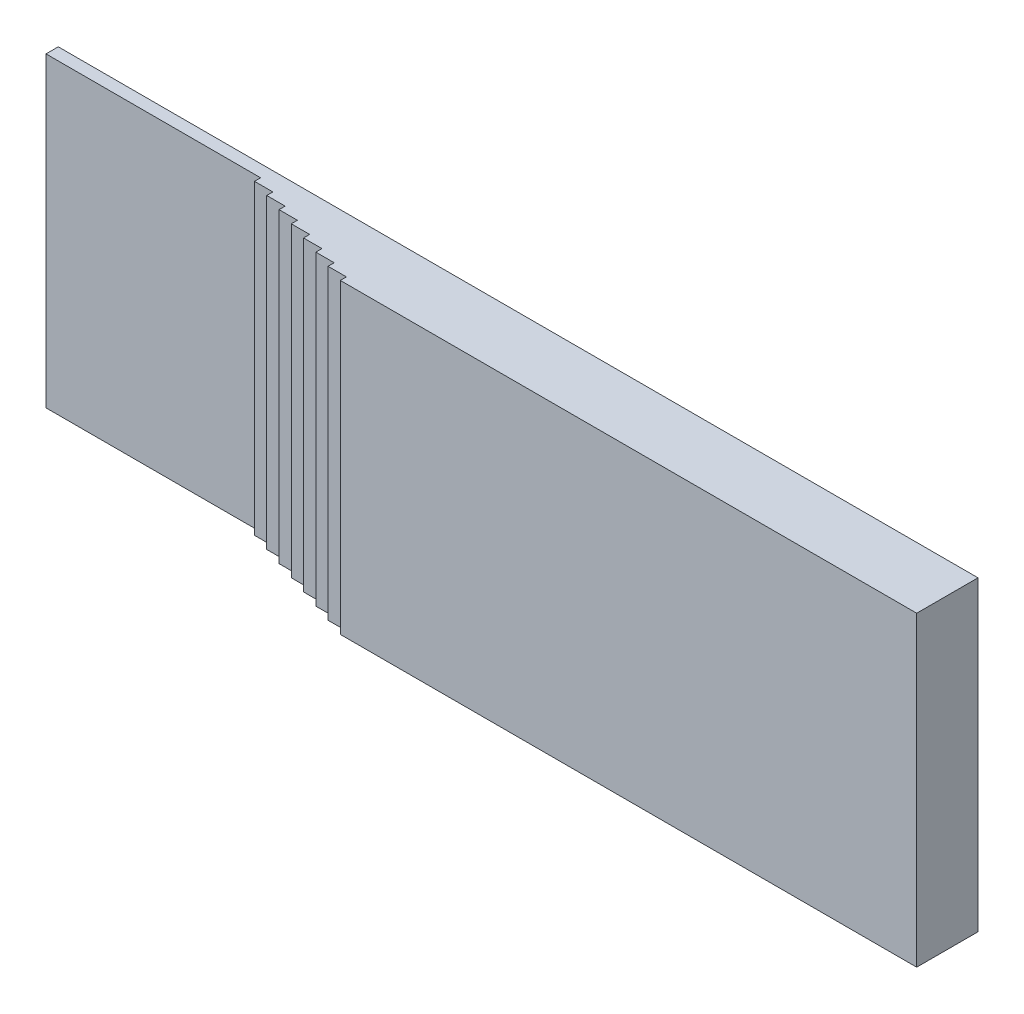
ISO-10303-21;
HEADER;
FILE_DESCRIPTION(('STEP AP214'),'2;1');
FILE_NAME('part.step','',(''),(''),'','','');
FILE_SCHEMA(('AUTOMOTIVE_DESIGN { 1 0 10303 214 1 1 1 1 }'));
ENDSEC;
DATA;
#1=APPLICATION_CONTEXT('core data for automotive mechanical design processes');
#2=APPLICATION_PROTOCOL_DEFINITION('international standard','automotive_design',2000,#1);
#3=PRODUCT_CONTEXT('',#1,'mechanical');
#4=PRODUCT('Part','Part','',(#3));
#5=PRODUCT_RELATED_PRODUCT_CATEGORY('part','',(#4));
#6=PRODUCT_DEFINITION_FORMATION('','',#4);
#7=PRODUCT_DEFINITION_CONTEXT('part definition',#1,'design');
#8=PRODUCT_DEFINITION('design','',#6,#7);
#9=PRODUCT_DEFINITION_SHAPE('','',#8);
#10=(LENGTH_UNIT() NAMED_UNIT(*) SI_UNIT(.MILLI.,.METRE.));
#11=(NAMED_UNIT(*) PLANE_ANGLE_UNIT() SI_UNIT($,.RADIAN.));
#12=(NAMED_UNIT(*) SI_UNIT($,.STERADIAN.) SOLID_ANGLE_UNIT());
#13=UNCERTAINTY_MEASURE_WITH_UNIT(LENGTH_MEASURE(1.E-05),#10,'distance_accuracy_value','');
#14=(GEOMETRIC_REPRESENTATION_CONTEXT(3) GLOBAL_UNCERTAINTY_ASSIGNED_CONTEXT((#13)) GLOBAL_UNIT_ASSIGNED_CONTEXT((#10,
#11,#12)) REPRESENTATION_CONTEXT('',''));
#15=CARTESIAN_POINT('',(0.,0.,0.));
#16=DIRECTION('',(0.,0.,1.));
#17=DIRECTION('',(1.,0.,0.));
#18=AXIS2_PLACEMENT_3D('',#15,#16,#17);
#19=CARTESIAN_POINT('',(0.,0.,200.));
#20=DIRECTION('',(0.,0.,1.));
#21=DIRECTION('',(1.,0.,0.));
#22=AXIS2_PLACEMENT_3D('',#19,#20,#21);
#23=PLANE('',#22);
#24=DIRECTION('',(1.,0.,0.));
#25=VECTOR('',#24,1.);
#26=CARTESIAN_POINT('',(-2500.,-2500.,200.));
#27=LINE('',#26,#25);
#28=CARTESIAN_POINT('',(-2500.,-2500.,200.));
#29=VERTEX_POINT('',#28);
#30=CARTESIAN_POINT('',(999.999999999999,-2500.,200.));
#31=VERTEX_POINT('',#30);
#32=EDGE_CURVE('E57',#29,#31,#27,.T.);
#33=ORIENTED_EDGE('',*,*,#32,.T.);
#34=DIRECTION('',(0.,1.,0.));
#35=VECTOR('',#34,1.);
#36=CARTESIAN_POINT('',(1000.,0.,200.));
#37=LINE('',#36,#35);
#38=CARTESIAN_POINT('',(1000.,2500.,200.));
#39=VERTEX_POINT('',#38);
#40=EDGE_CURVE('E62',#31,#39,#37,.T.);
#41=ORIENTED_EDGE('',*,*,#40,.T.);
#42=DIRECTION('',(-1.,0.,0.));
#43=VECTOR('',#42,1.);
#44=CARTESIAN_POINT('',(-2500.,2500.,200.));
#45=LINE('',#44,#43);
#46=CARTESIAN_POINT('',(-2500.,2500.,200.));
#47=VERTEX_POINT('',#46);
#48=EDGE_CURVE('E369',#39,#47,#45,.T.);
#49=ORIENTED_EDGE('',*,*,#48,.T.);
#50=DIRECTION('',(0.,-1.,0.));
#51=VECTOR('',#50,1.);
#52=CARTESIAN_POINT('',(-2500.,2500.,200.));
#53=LINE('',#52,#51);
#54=EDGE_CURVE('E372',#47,#29,#53,.T.);
#55=ORIENTED_EDGE('',*,*,#54,.T.);
#56=EDGE_LOOP('',(#33,#41,#49,#55));
#57=FACE_BOUND('',#56,.T.);
#58=ADVANCED_FACE('F41',(#57),#23,.T.);
#59=CARTESIAN_POINT('',(12500.,2500.,200.));
#60=DIRECTION('',(-1.,0.,0.));
#61=DIRECTION('',(0.,-1.,0.));
#62=AXIS2_PLACEMENT_3D('',#59,#60,#61);
#63=PLANE('',#62);
#64=DIRECTION('',(0.,1.,0.));
#65=VECTOR('',#64,1.);
#66=CARTESIAN_POINT('',(12500.,2500.,0.));
#67=LINE('',#66,#65);
#68=CARTESIAN_POINT('',(12500.,-2500.,0.));
#69=VERTEX_POINT('',#68);
#70=CARTESIAN_POINT('',(12500.,2500.,0.));
#71=VERTEX_POINT('',#70);
#72=EDGE_CURVE('E183',#69,#71,#67,.T.);
#73=ORIENTED_EDGE('',*,*,#72,.T.);
#74=DIRECTION('',(0.,0.,-1.));
#75=VECTOR('',#74,1.);
#76=CARTESIAN_POINT('',(12500.,2500.,200.));
#77=LINE('',#76,#75);
#78=CARTESIAN_POINT('',(12500.,2500.,1000.));
#79=VERTEX_POINT('',#78);
#80=EDGE_CURVE('E11',#79,#71,#77,.T.);
#81=ORIENTED_EDGE('',*,*,#80,.F.);
#82=DIRECTION('',(0.,1.,0.));
#83=VECTOR('',#82,1.);
#84=CARTESIAN_POINT('',(12500.,-2500.,1000.));
#85=LINE('',#84,#83);
#86=CARTESIAN_POINT('',(12500.,-2500.,1000.));
#87=VERTEX_POINT('',#86);
#88=EDGE_CURVE('E181',#87,#79,#85,.T.);
#89=ORIENTED_EDGE('',*,*,#88,.F.);
#90=DIRECTION('',(0.,0.,-1.));
#91=VECTOR('',#90,1.);
#92=CARTESIAN_POINT('',(12500.,-2500.,200.));
#93=LINE('',#92,#91);
#94=EDGE_CURVE('E378',#87,#69,#93,.T.);
#95=ORIENTED_EDGE('',*,*,#94,.T.);
#96=EDGE_LOOP('',(#73,#81,#89,#95));
#97=FACE_BOUND('',#96,.T.);
#98=ADVANCED_FACE('F43',(#97),#63,.F.);
#99=CARTESIAN_POINT('',(-2500.,2500.,200.));
#100=DIRECTION('',(0.,-1.,0.));
#101=DIRECTION('',(1.,0.,0.));
#102=AXIS2_PLACEMENT_3D('',#99,#100,#101);
#103=PLANE('',#102);
#104=DIRECTION('',(-1.,0.,0.));
#105=VECTOR('',#104,1.);
#106=CARTESIAN_POINT('',(-2500.,2500.,0.));
#107=LINE('',#106,#105);
#108=CARTESIAN_POINT('',(-2500.,2500.,0.));
#109=VERTEX_POINT('',#108);
#110=EDGE_CURVE('E381',#71,#109,#107,.T.);
#111=ORIENTED_EDGE('',*,*,#110,.T.);
#112=DIRECTION('',(0.,0.,-1.));
#113=VECTOR('',#112,1.);
#114=CARTESIAN_POINT('',(-2500.,2500.,200.));
#115=LINE('',#114,#113);
#116=EDGE_CURVE('E50',#47,#109,#115,.T.);
#117=ORIENTED_EDGE('',*,*,#116,.F.);
#118=ORIENTED_EDGE('',*,*,#48,.F.);
#119=DIRECTION('',(0.,0.,-1.));
#120=VECTOR('',#119,1.);
#121=CARTESIAN_POINT('',(1000.,2500.,300.));
#122=LINE('',#121,#120);
#123=CARTESIAN_POINT('',(1000.,2500.,300.));
#124=VERTEX_POINT('',#123);
#125=EDGE_CURVE('E365',#124,#39,#122,.T.);
#126=ORIENTED_EDGE('',*,*,#125,.F.);
#127=DIRECTION('',(-1.,0.,0.));
#128=VECTOR('',#127,1.);
#129=CARTESIAN_POINT('',(-1.48029736616688E-13,2500.,300.));
#130=LINE('',#129,#128);
#131=CARTESIAN_POINT('',(1300.,2500.,300.));
#132=VERTEX_POINT('',#131);
#133=EDGE_CURVE('E353',#132,#124,#130,.T.);
#134=ORIENTED_EDGE('',*,*,#133,.F.);
#135=DIRECTION('',(0.,0.,-1.));
#136=VECTOR('',#135,1.);
#137=CARTESIAN_POINT('',(1300.,2500.,400.));
#138=LINE('',#137,#136);
#139=CARTESIAN_POINT('',(1300.,2500.,400.));
#140=VERTEX_POINT('',#139);
#141=EDGE_CURVE('E342',#140,#132,#138,.T.);
#142=ORIENTED_EDGE('',*,*,#141,.F.);
#143=DIRECTION('',(-1.,0.,0.));
#144=VECTOR('',#143,1.);
#145=CARTESIAN_POINT('',(-1.48029736616688E-13,2500.,400.));
#146=LINE('',#145,#144);
#147=CARTESIAN_POINT('',(1600.,2500.,400.));
#148=VERTEX_POINT('',#147);
#149=EDGE_CURVE('E331',#148,#140,#146,.T.);
#150=ORIENTED_EDGE('',*,*,#149,.F.);
#151=DIRECTION('',(0.,0.,-1.));
#152=VECTOR('',#151,1.);
#153=CARTESIAN_POINT('',(1600.,2500.,500.));
#154=LINE('',#153,#152);
#155=CARTESIAN_POINT('',(1600.,2500.,500.));
#156=VERTEX_POINT('',#155);
#157=EDGE_CURVE('E320',#156,#148,#154,.T.);
#158=ORIENTED_EDGE('',*,*,#157,.F.);
#159=DIRECTION('',(-1.,0.,0.));
#160=VECTOR('',#159,1.);
#161=CARTESIAN_POINT('',(-1.48029736616688E-13,2500.,500.));
#162=LINE('',#161,#160);
#163=CARTESIAN_POINT('',(1900.,2500.,500.));
#164=VERTEX_POINT('',#163);
#165=EDGE_CURVE('E309',#164,#156,#162,.T.);
#166=ORIENTED_EDGE('',*,*,#165,.F.);
#167=DIRECTION('',(0.,0.,-1.));
#168=VECTOR('',#167,1.);
#169=CARTESIAN_POINT('',(1900.,2500.,600.));
#170=LINE('',#169,#168);
#171=CARTESIAN_POINT('',(1900.,2500.,600.));
#172=VERTEX_POINT('',#171);
#173=EDGE_CURVE('E298',#172,#164,#170,.T.);
#174=ORIENTED_EDGE('',*,*,#173,.F.);
#175=DIRECTION('',(-1.,0.,0.));
#176=VECTOR('',#175,1.);
#177=CARTESIAN_POINT('',(-1.48029736616688E-13,2500.,600.));
#178=LINE('',#177,#176);
#179=CARTESIAN_POINT('',(2200.,2500.,600.));
#180=VERTEX_POINT('',#179);
#181=EDGE_CURVE('E287',#180,#172,#178,.T.);
#182=ORIENTED_EDGE('',*,*,#181,.F.);
#183=DIRECTION('',(0.,0.,-1.));
#184=VECTOR('',#183,1.);
#185=CARTESIAN_POINT('',(2200.,2500.,700.));
#186=LINE('',#185,#184);
#187=CARTESIAN_POINT('',(2200.,2500.,700.));
#188=VERTEX_POINT('',#187);
#189=EDGE_CURVE('E276',#188,#180,#186,.T.);
#190=ORIENTED_EDGE('',*,*,#189,.F.);
#191=DIRECTION('',(-1.,0.,0.));
#192=VECTOR('',#191,1.);
#193=CARTESIAN_POINT('',(-1.48029736616688E-13,2500.,700.));
#194=LINE('',#193,#192);
#195=CARTESIAN_POINT('',(2500.,2500.,700.));
#196=VERTEX_POINT('',#195);
#197=EDGE_CURVE('E265',#196,#188,#194,.T.);
#198=ORIENTED_EDGE('',*,*,#197,.F.);
#199=DIRECTION('',(0.,0.,-1.));
#200=VECTOR('',#199,1.);
#201=CARTESIAN_POINT('',(2500.,2500.,800.));
#202=LINE('',#201,#200);
#203=CARTESIAN_POINT('',(2500.,2500.,800.));
#204=VERTEX_POINT('',#203);
#205=EDGE_CURVE('E254',#204,#196,#202,.T.);
#206=ORIENTED_EDGE('',*,*,#205,.F.);
#207=DIRECTION('',(-1.,0.,0.));
#208=VECTOR('',#207,1.);
#209=CARTESIAN_POINT('',(-1.48029736616688E-13,2500.,800.));
#210=LINE('',#209,#208);
#211=CARTESIAN_POINT('',(2800.,2500.,800.));
#212=VERTEX_POINT('',#211);
#213=EDGE_CURVE('E243',#212,#204,#210,.T.);
#214=ORIENTED_EDGE('',*,*,#213,.F.);
#215=DIRECTION('',(0.,0.,-1.));
#216=VECTOR('',#215,1.);
#217=CARTESIAN_POINT('',(2800.,2500.,900.));
#218=LINE('',#217,#216);
#219=CARTESIAN_POINT('',(2800.,2500.,900.));
#220=VERTEX_POINT('',#219);
#221=EDGE_CURVE('E232',#220,#212,#218,.T.);
#222=ORIENTED_EDGE('',*,*,#221,.F.);
#223=DIRECTION('',(-1.,0.,0.));
#224=VECTOR('',#223,1.);
#225=CARTESIAN_POINT('',(-1.48029736616688E-13,2500.,900.));
#226=LINE('',#225,#224);
#227=CARTESIAN_POINT('',(3100.,2500.,900.));
#228=VERTEX_POINT('',#227);
#229=EDGE_CURVE('E221',#228,#220,#226,.T.);
#230=ORIENTED_EDGE('',*,*,#229,.F.);
#231=DIRECTION('',(0.,0.,-1.));
#232=VECTOR('',#231,1.);
#233=CARTESIAN_POINT('',(3100.,2500.,1000.));
#234=LINE('',#233,#232);
#235=CARTESIAN_POINT('',(3100.,2500.,1000.));
#236=VERTEX_POINT('',#235);
#237=EDGE_CURVE('E189',#236,#228,#234,.T.);
#238=ORIENTED_EDGE('',*,*,#237,.F.);
#239=DIRECTION('',(-1.,0.,0.));
#240=VECTOR('',#239,1.);
#241=CARTESIAN_POINT('',(-1.48029736616688E-13,2500.,1000.));
#242=LINE('',#241,#240);
#243=EDGE_CURVE('E186',#79,#236,#242,.T.);
#244=ORIENTED_EDGE('',*,*,#243,.F.);
#245=ORIENTED_EDGE('',*,*,#80,.T.);
#246=EDGE_LOOP('',(#111,#117,#118,#126,#134,#142,#150,#158,#166,#174,#182,#190,#198,#206,#214,
#222,#230,#238,#244,#245));
#247=FACE_BOUND('',#246,.T.);
#248=ADVANCED_FACE('F187',(#247),#103,.F.);
#249=CARTESIAN_POINT('',(-2500.,2500.,200.));
#250=DIRECTION('',(1.,0.,0.));
#251=DIRECTION('',(0.,1.,0.));
#252=AXIS2_PLACEMENT_3D('',#249,#250,#251);
#253=PLANE('',#252);
#254=DIRECTION('',(0.,-1.,0.));
#255=VECTOR('',#254,1.);
#256=CARTESIAN_POINT('',(-2500.,2500.,0.));
#257=LINE('',#256,#255);
#258=CARTESIAN_POINT('',(-2500.,-2500.,0.));
#259=VERTEX_POINT('',#258);
#260=EDGE_CURVE('E384',#109,#259,#257,.T.);
#261=ORIENTED_EDGE('',*,*,#260,.T.);
#262=DIRECTION('',(0.,0.,-1.));
#263=VECTOR('',#262,1.);
#264=CARTESIAN_POINT('',(-2500.,-2500.,200.));
#265=LINE('',#264,#263);
#266=EDGE_CURVE('E391',#29,#259,#265,.T.);
#267=ORIENTED_EDGE('',*,*,#266,.F.);
#268=ORIENTED_EDGE('',*,*,#54,.F.);
#269=ORIENTED_EDGE('',*,*,#116,.T.);
#270=EDGE_LOOP('',(#261,#267,#268,#269));
#271=FACE_BOUND('',#270,.T.);
#272=ADVANCED_FACE('F400',(#271),#253,.F.);
#273=CARTESIAN_POINT('',(-2500.,-2500.,200.));
#274=DIRECTION('',(0.,1.,0.));
#275=DIRECTION('',(-1.,0.,0.));
#276=AXIS2_PLACEMENT_3D('',#273,#274,#275);
#277=PLANE('',#276);
#278=ORIENTED_EDGE('',*,*,#94,.F.);
#279=DIRECTION('',(1.,0.,0.));
#280=VECTOR('',#279,1.);
#281=CARTESIAN_POINT('',(1.48029736616687E-13,-2500.,1000.));
#282=LINE('',#281,#280);
#283=CARTESIAN_POINT('',(3100.,-2500.,1000.));
#284=VERTEX_POINT('',#283);
#285=EDGE_CURVE('E195',#284,#87,#282,.T.);
#286=ORIENTED_EDGE('',*,*,#285,.F.);
#287=DIRECTION('',(0.,0.,-1.));
#288=VECTOR('',#287,1.);
#289=CARTESIAN_POINT('',(3100.,-2500.,1000.));
#290=LINE('',#289,#288);
#291=CARTESIAN_POINT('',(3100.,-2500.,900.));
#292=VERTEX_POINT('',#291);
#293=EDGE_CURVE('E207',#284,#292,#290,.T.);
#294=ORIENTED_EDGE('',*,*,#293,.T.);
#295=DIRECTION('',(1.,0.,0.));
#296=VECTOR('',#295,1.);
#297=CARTESIAN_POINT('',(1.48029736616687E-13,-2500.,900.));
#298=LINE('',#297,#296);
#299=CARTESIAN_POINT('',(2800.,-2500.,900.));
#300=VERTEX_POINT('',#299);
#301=EDGE_CURVE('E213',#300,#292,#298,.T.);
#302=ORIENTED_EDGE('',*,*,#301,.F.);
#303=DIRECTION('',(0.,0.,-1.));
#304=VECTOR('',#303,1.);
#305=CARTESIAN_POINT('',(2800.,-2500.,900.));
#306=LINE('',#305,#304);
#307=CARTESIAN_POINT('',(2800.,-2500.,800.));
#308=VERTEX_POINT('',#307);
#309=EDGE_CURVE('E228',#300,#308,#306,.T.);
#310=ORIENTED_EDGE('',*,*,#309,.T.);
#311=DIRECTION('',(1.,0.,0.));
#312=VECTOR('',#311,1.);
#313=CARTESIAN_POINT('',(1.48029736616687E-13,-2500.,800.));
#314=LINE('',#313,#312);
#315=CARTESIAN_POINT('',(2500.,-2500.,800.));
#316=VERTEX_POINT('',#315);
#317=EDGE_CURVE('E235',#316,#308,#314,.T.);
#318=ORIENTED_EDGE('',*,*,#317,.F.);
#319=DIRECTION('',(0.,0.,-1.));
#320=VECTOR('',#319,1.);
#321=CARTESIAN_POINT('',(2500.,-2500.,800.));
#322=LINE('',#321,#320);
#323=CARTESIAN_POINT('',(2500.,-2500.,700.));
#324=VERTEX_POINT('',#323);
#325=EDGE_CURVE('E250',#316,#324,#322,.T.);
#326=ORIENTED_EDGE('',*,*,#325,.T.);
#327=DIRECTION('',(1.,0.,0.));
#328=VECTOR('',#327,1.);
#329=CARTESIAN_POINT('',(1.48029736616687E-13,-2500.,700.));
#330=LINE('',#329,#328);
#331=CARTESIAN_POINT('',(2200.,-2500.,700.));
#332=VERTEX_POINT('',#331);
#333=EDGE_CURVE('E257',#332,#324,#330,.T.);
#334=ORIENTED_EDGE('',*,*,#333,.F.);
#335=DIRECTION('',(0.,0.,-1.));
#336=VECTOR('',#335,1.);
#337=CARTESIAN_POINT('',(2200.,-2500.,700.));
#338=LINE('',#337,#336);
#339=CARTESIAN_POINT('',(2200.,-2500.,600.));
#340=VERTEX_POINT('',#339);
#341=EDGE_CURVE('E272',#332,#340,#338,.T.);
#342=ORIENTED_EDGE('',*,*,#341,.T.);
#343=DIRECTION('',(1.,0.,0.));
#344=VECTOR('',#343,1.);
#345=CARTESIAN_POINT('',(1.48029736616687E-13,-2500.,600.));
#346=LINE('',#345,#344);
#347=CARTESIAN_POINT('',(1900.,-2500.,600.));
#348=VERTEX_POINT('',#347);
#349=EDGE_CURVE('E279',#348,#340,#346,.T.);
#350=ORIENTED_EDGE('',*,*,#349,.F.);
#351=DIRECTION('',(0.,0.,-1.));
#352=VECTOR('',#351,1.);
#353=CARTESIAN_POINT('',(1900.,-2500.,600.));
#354=LINE('',#353,#352);
#355=CARTESIAN_POINT('',(1900.,-2500.,500.));
#356=VERTEX_POINT('',#355);
#357=EDGE_CURVE('E294',#348,#356,#354,.T.);
#358=ORIENTED_EDGE('',*,*,#357,.T.);
#359=DIRECTION('',(1.,0.,0.));
#360=VECTOR('',#359,1.);
#361=CARTESIAN_POINT('',(1.48029736616687E-13,-2500.,500.));
#362=LINE('',#361,#360);
#363=CARTESIAN_POINT('',(1600.,-2500.,500.));
#364=VERTEX_POINT('',#363);
#365=EDGE_CURVE('E301',#364,#356,#362,.T.);
#366=ORIENTED_EDGE('',*,*,#365,.F.);
#367=DIRECTION('',(0.,0.,-1.));
#368=VECTOR('',#367,1.);
#369=CARTESIAN_POINT('',(1600.,-2500.,500.));
#370=LINE('',#369,#368);
#371=CARTESIAN_POINT('',(1600.,-2500.,400.));
#372=VERTEX_POINT('',#371);
#373=EDGE_CURVE('E316',#364,#372,#370,.T.);
#374=ORIENTED_EDGE('',*,*,#373,.T.);
#375=DIRECTION('',(1.,0.,0.));
#376=VECTOR('',#375,1.);
#377=CARTESIAN_POINT('',(1.48029736616687E-13,-2500.,400.));
#378=LINE('',#377,#376);
#379=CARTESIAN_POINT('',(1300.,-2500.,400.));
#380=VERTEX_POINT('',#379);
#381=EDGE_CURVE('E323',#380,#372,#378,.T.);
#382=ORIENTED_EDGE('',*,*,#381,.F.);
#383=DIRECTION('',(0.,0.,-1.));
#384=VECTOR('',#383,1.);
#385=CARTESIAN_POINT('',(1300.,-2500.,400.));
#386=LINE('',#385,#384);
#387=CARTESIAN_POINT('',(1300.,-2500.,300.));
#388=VERTEX_POINT('',#387);
#389=EDGE_CURVE('E338',#380,#388,#386,.T.);
#390=ORIENTED_EDGE('',*,*,#389,.T.);
#391=DIRECTION('',(1.,0.,0.));
#392=VECTOR('',#391,1.);
#393=CARTESIAN_POINT('',(1.48029736616687E-13,-2500.,300.));
#394=LINE('',#393,#392);
#395=CARTESIAN_POINT('',(1000.,-2500.,300.));
#396=VERTEX_POINT('',#395);
#397=EDGE_CURVE('E345',#396,#388,#394,.T.);
#398=ORIENTED_EDGE('',*,*,#397,.F.);
#399=DIRECTION('',(0.,0.,-1.));
#400=VECTOR('',#399,1.);
#401=CARTESIAN_POINT('',(1000.,-2500.,300.));
#402=LINE('',#401,#400);
#403=EDGE_CURVE('E360',#396,#31,#402,.T.);
#404=ORIENTED_EDGE('',*,*,#403,.T.);
#405=ORIENTED_EDGE('',*,*,#32,.F.);
#406=ORIENTED_EDGE('',*,*,#266,.T.);
#407=DIRECTION('',(1.,0.,0.));
#408=VECTOR('',#407,1.);
#409=CARTESIAN_POINT('',(-2500.,-2500.,0.));
#410=LINE('',#409,#408);
#411=EDGE_CURVE('E373',#259,#69,#410,.T.);
#412=ORIENTED_EDGE('',*,*,#411,.T.);
#413=EDGE_LOOP('',(#278,#286,#294,#302,#310,#318,#326,#334,#342,#350,#358,#366,#374,#382,#390,
#398,#404,#405,#406,#412));
#414=FACE_BOUND('',#413,.T.);
#415=ADVANCED_FACE('F406',(#414),#277,.F.);
#416=CARTESIAN_POINT('',(0.,0.,0.));
#417=DIRECTION('',(0.,0.,1.));
#418=DIRECTION('',(1.,0.,0.));
#419=AXIS2_PLACEMENT_3D('',#416,#417,#418);
#420=PLANE('',#419);
#421=ORIENTED_EDGE('',*,*,#72,.F.);
#422=ORIENTED_EDGE('',*,*,#411,.F.);
#423=ORIENTED_EDGE('',*,*,#260,.F.);
#424=ORIENTED_EDGE('',*,*,#110,.F.);
#425=EDGE_LOOP('',(#421,#422,#423,#424));
#426=FACE_BOUND('',#425,.T.);
#427=ADVANCED_FACE('F404',(#426),#420,.F.);
#428=CARTESIAN_POINT('',(1000.,0.,300.));
#429=DIRECTION('',(-1.,0.,0.));
#430=DIRECTION('',(0.,0.,1.));
#431=AXIS2_PLACEMENT_3D('',#428,#429,#430);
#432=PLANE('',#431);
#433=ORIENTED_EDGE('',*,*,#40,.F.);
#434=ORIENTED_EDGE('',*,*,#403,.F.);
#435=DIRECTION('',(0.,1.,0.));
#436=VECTOR('',#435,1.);
#437=CARTESIAN_POINT('',(1000.,0.,300.));
#438=LINE('',#437,#436);
#439=EDGE_CURVE('E356',#396,#124,#438,.T.);
#440=ORIENTED_EDGE('',*,*,#439,.T.);
#441=ORIENTED_EDGE('',*,*,#125,.T.);
#442=EDGE_LOOP('',(#433,#434,#440,#441));
#443=FACE_BOUND('',#442,.T.);
#444=ADVANCED_FACE('F410',(#443),#432,.T.);
#445=CARTESIAN_POINT('',(0.,0.,300.));
#446=DIRECTION('',(0.,0.,1.));
#447=DIRECTION('',(1.,0.,0.));
#448=AXIS2_PLACEMENT_3D('',#445,#446,#447);
#449=PLANE('',#448);
#450=ORIENTED_EDGE('',*,*,#397,.T.);
#451=DIRECTION('',(0.,1.,0.));
#452=VECTOR('',#451,1.);
#453=CARTESIAN_POINT('',(1300.,0.,300.));
#454=LINE('',#453,#452);
#455=EDGE_CURVE('E349',#388,#132,#454,.T.);
#456=ORIENTED_EDGE('',*,*,#455,.T.);
#457=ORIENTED_EDGE('',*,*,#133,.T.);
#458=ORIENTED_EDGE('',*,*,#439,.F.);
#459=EDGE_LOOP('',(#450,#456,#457,#458));
#460=FACE_BOUND('',#459,.T.);
#461=ADVANCED_FACE('F451',(#460),#449,.T.);
#462=CARTESIAN_POINT('',(1300.,0.,400.));
#463=DIRECTION('',(-1.,0.,0.));
#464=DIRECTION('',(0.,0.,1.));
#465=AXIS2_PLACEMENT_3D('',#462,#463,#464);
#466=PLANE('',#465);
#467=ORIENTED_EDGE('',*,*,#141,.T.);
#468=ORIENTED_EDGE('',*,*,#455,.F.);
#469=ORIENTED_EDGE('',*,*,#389,.F.);
#470=DIRECTION('',(0.,1.,0.));
#471=VECTOR('',#470,1.);
#472=CARTESIAN_POINT('',(1300.,0.,400.));
#473=LINE('',#472,#471);
#474=EDGE_CURVE('E334',#380,#140,#473,.T.);
#475=ORIENTED_EDGE('',*,*,#474,.T.);
#476=EDGE_LOOP('',(#467,#468,#469,#475));
#477=FACE_BOUND('',#476,.T.);
#478=ADVANCED_FACE('F457',(#477),#466,.T.);
#479=CARTESIAN_POINT('',(0.,0.,400.));
#480=DIRECTION('',(0.,0.,1.));
#481=DIRECTION('',(1.,0.,0.));
#482=AXIS2_PLACEMENT_3D('',#479,#480,#481);
#483=PLANE('',#482);
#484=ORIENTED_EDGE('',*,*,#381,.T.);
#485=DIRECTION('',(0.,1.,0.));
#486=VECTOR('',#485,1.);
#487=CARTESIAN_POINT('',(1600.,0.,400.));
#488=LINE('',#487,#486);
#489=EDGE_CURVE('E327',#372,#148,#488,.T.);
#490=ORIENTED_EDGE('',*,*,#489,.T.);
#491=ORIENTED_EDGE('',*,*,#149,.T.);
#492=ORIENTED_EDGE('',*,*,#474,.F.);
#493=EDGE_LOOP('',(#484,#490,#491,#492));
#494=FACE_BOUND('',#493,.T.);
#495=ADVANCED_FACE('F464',(#494),#483,.T.);
#496=CARTESIAN_POINT('',(1600.,0.,500.));
#497=DIRECTION('',(-1.,0.,0.));
#498=DIRECTION('',(0.,0.,1.));
#499=AXIS2_PLACEMENT_3D('',#496,#497,#498);
#500=PLANE('',#499);
#501=ORIENTED_EDGE('',*,*,#157,.T.);
#502=ORIENTED_EDGE('',*,*,#489,.F.);
#503=ORIENTED_EDGE('',*,*,#373,.F.);
#504=DIRECTION('',(0.,1.,0.));
#505=VECTOR('',#504,1.);
#506=CARTESIAN_POINT('',(1600.,0.,500.));
#507=LINE('',#506,#505);
#508=EDGE_CURVE('E312',#364,#156,#507,.T.);
#509=ORIENTED_EDGE('',*,*,#508,.T.);
#510=EDGE_LOOP('',(#501,#502,#503,#509));
#511=FACE_BOUND('',#510,.T.);
#512=ADVANCED_FACE('F472',(#511),#500,.T.);
#513=CARTESIAN_POINT('',(0.,0.,500.));
#514=DIRECTION('',(0.,0.,1.));
#515=DIRECTION('',(1.,0.,0.));
#516=AXIS2_PLACEMENT_3D('',#513,#514,#515);
#517=PLANE('',#516);
#518=ORIENTED_EDGE('',*,*,#365,.T.);
#519=DIRECTION('',(0.,1.,0.));
#520=VECTOR('',#519,1.);
#521=CARTESIAN_POINT('',(1900.,0.,500.));
#522=LINE('',#521,#520);
#523=EDGE_CURVE('E305',#356,#164,#522,.T.);
#524=ORIENTED_EDGE('',*,*,#523,.T.);
#525=ORIENTED_EDGE('',*,*,#165,.T.);
#526=ORIENTED_EDGE('',*,*,#508,.F.);
#527=EDGE_LOOP('',(#518,#524,#525,#526));
#528=FACE_BOUND('',#527,.T.);
#529=ADVANCED_FACE('F480',(#528),#517,.T.);
#530=CARTESIAN_POINT('',(1900.,0.,600.));
#531=DIRECTION('',(-1.,0.,0.));
#532=DIRECTION('',(0.,0.,1.));
#533=AXIS2_PLACEMENT_3D('',#530,#531,#532);
#534=PLANE('',#533);
#535=ORIENTED_EDGE('',*,*,#173,.T.);
#536=ORIENTED_EDGE('',*,*,#523,.F.);
#537=ORIENTED_EDGE('',*,*,#357,.F.);
#538=DIRECTION('',(0.,1.,0.));
#539=VECTOR('',#538,1.);
#540=CARTESIAN_POINT('',(1900.,0.,600.));
#541=LINE('',#540,#539);
#542=EDGE_CURVE('E290',#348,#172,#541,.T.);
#543=ORIENTED_EDGE('',*,*,#542,.T.);
#544=EDGE_LOOP('',(#535,#536,#537,#543));
#545=FACE_BOUND('',#544,.T.);
#546=ADVANCED_FACE('F488',(#545),#534,.T.);
#547=CARTESIAN_POINT('',(0.,0.,600.));
#548=DIRECTION('',(0.,0.,1.));
#549=DIRECTION('',(1.,0.,0.));
#550=AXIS2_PLACEMENT_3D('',#547,#548,#549);
#551=PLANE('',#550);
#552=ORIENTED_EDGE('',*,*,#349,.T.);
#553=DIRECTION('',(0.,1.,0.));
#554=VECTOR('',#553,1.);
#555=CARTESIAN_POINT('',(2200.,0.,600.));
#556=LINE('',#555,#554);
#557=EDGE_CURVE('E283',#340,#180,#556,.T.);
#558=ORIENTED_EDGE('',*,*,#557,.T.);
#559=ORIENTED_EDGE('',*,*,#181,.T.);
#560=ORIENTED_EDGE('',*,*,#542,.F.);
#561=EDGE_LOOP('',(#552,#558,#559,#560));
#562=FACE_BOUND('',#561,.T.);
#563=ADVANCED_FACE('F496',(#562),#551,.T.);
#564=CARTESIAN_POINT('',(2200.,0.,700.));
#565=DIRECTION('',(-1.,0.,0.));
#566=DIRECTION('',(0.,0.,1.));
#567=AXIS2_PLACEMENT_3D('',#564,#565,#566);
#568=PLANE('',#567);
#569=ORIENTED_EDGE('',*,*,#189,.T.);
#570=ORIENTED_EDGE('',*,*,#557,.F.);
#571=ORIENTED_EDGE('',*,*,#341,.F.);
#572=DIRECTION('',(0.,1.,0.));
#573=VECTOR('',#572,1.);
#574=CARTESIAN_POINT('',(2200.,0.,700.));
#575=LINE('',#574,#573);
#576=EDGE_CURVE('E268',#332,#188,#575,.T.);
#577=ORIENTED_EDGE('',*,*,#576,.T.);
#578=EDGE_LOOP('',(#569,#570,#571,#577));
#579=FACE_BOUND('',#578,.T.);
#580=ADVANCED_FACE('F504',(#579),#568,.T.);
#581=CARTESIAN_POINT('',(0.,0.,700.));
#582=DIRECTION('',(0.,0.,1.));
#583=DIRECTION('',(1.,0.,0.));
#584=AXIS2_PLACEMENT_3D('',#581,#582,#583);
#585=PLANE('',#584);
#586=ORIENTED_EDGE('',*,*,#333,.T.);
#587=DIRECTION('',(0.,1.,0.));
#588=VECTOR('',#587,1.);
#589=CARTESIAN_POINT('',(2500.,0.,700.));
#590=LINE('',#589,#588);
#591=EDGE_CURVE('E261',#324,#196,#590,.T.);
#592=ORIENTED_EDGE('',*,*,#591,.T.);
#593=ORIENTED_EDGE('',*,*,#197,.T.);
#594=ORIENTED_EDGE('',*,*,#576,.F.);
#595=EDGE_LOOP('',(#586,#592,#593,#594));
#596=FACE_BOUND('',#595,.T.);
#597=ADVANCED_FACE('F512',(#596),#585,.T.);
#598=CARTESIAN_POINT('',(2500.,0.,800.));
#599=DIRECTION('',(-1.,0.,0.));
#600=DIRECTION('',(0.,0.,1.));
#601=AXIS2_PLACEMENT_3D('',#598,#599,#600);
#602=PLANE('',#601);
#603=ORIENTED_EDGE('',*,*,#205,.T.);
#604=ORIENTED_EDGE('',*,*,#591,.F.);
#605=ORIENTED_EDGE('',*,*,#325,.F.);
#606=DIRECTION('',(0.,1.,0.));
#607=VECTOR('',#606,1.);
#608=CARTESIAN_POINT('',(2500.,0.,800.));
#609=LINE('',#608,#607);
#610=EDGE_CURVE('E246',#316,#204,#609,.T.);
#611=ORIENTED_EDGE('',*,*,#610,.T.);
#612=EDGE_LOOP('',(#603,#604,#605,#611));
#613=FACE_BOUND('',#612,.T.);
#614=ADVANCED_FACE('F520',(#613),#602,.T.);
#615=CARTESIAN_POINT('',(0.,0.,800.));
#616=DIRECTION('',(0.,0.,1.));
#617=DIRECTION('',(1.,0.,0.));
#618=AXIS2_PLACEMENT_3D('',#615,#616,#617);
#619=PLANE('',#618);
#620=ORIENTED_EDGE('',*,*,#317,.T.);
#621=DIRECTION('',(0.,1.,0.));
#622=VECTOR('',#621,1.);
#623=CARTESIAN_POINT('',(2800.,0.,800.));
#624=LINE('',#623,#622);
#625=EDGE_CURVE('E239',#308,#212,#624,.T.);
#626=ORIENTED_EDGE('',*,*,#625,.T.);
#627=ORIENTED_EDGE('',*,*,#213,.T.);
#628=ORIENTED_EDGE('',*,*,#610,.F.);
#629=EDGE_LOOP('',(#620,#626,#627,#628));
#630=FACE_BOUND('',#629,.T.);
#631=ADVANCED_FACE('F528',(#630),#619,.T.);
#632=CARTESIAN_POINT('',(2800.,0.,900.));
#633=DIRECTION('',(-1.,0.,0.));
#634=DIRECTION('',(0.,0.,1.));
#635=AXIS2_PLACEMENT_3D('',#632,#633,#634);
#636=PLANE('',#635);
#637=ORIENTED_EDGE('',*,*,#221,.T.);
#638=ORIENTED_EDGE('',*,*,#625,.F.);
#639=ORIENTED_EDGE('',*,*,#309,.F.);
#640=DIRECTION('',(0.,1.,0.));
#641=VECTOR('',#640,1.);
#642=CARTESIAN_POINT('',(2800.,0.,900.));
#643=LINE('',#642,#641);
#644=EDGE_CURVE('E224',#300,#220,#643,.T.);
#645=ORIENTED_EDGE('',*,*,#644,.T.);
#646=EDGE_LOOP('',(#637,#638,#639,#645));
#647=FACE_BOUND('',#646,.T.);
#648=ADVANCED_FACE('F536',(#647),#636,.T.);
#649=CARTESIAN_POINT('',(0.,0.,900.));
#650=DIRECTION('',(0.,0.,1.));
#651=DIRECTION('',(1.,0.,0.));
#652=AXIS2_PLACEMENT_3D('',#649,#650,#651);
#653=PLANE('',#652);
#654=ORIENTED_EDGE('',*,*,#301,.T.);
#655=DIRECTION('',(0.,1.,0.));
#656=VECTOR('',#655,1.);
#657=CARTESIAN_POINT('',(3100.,0.,900.));
#658=LINE('',#657,#656);
#659=EDGE_CURVE('E217',#292,#228,#658,.T.);
#660=ORIENTED_EDGE('',*,*,#659,.T.);
#661=ORIENTED_EDGE('',*,*,#229,.T.);
#662=ORIENTED_EDGE('',*,*,#644,.F.);
#663=EDGE_LOOP('',(#654,#660,#661,#662));
#664=FACE_BOUND('',#663,.T.);
#665=ADVANCED_FACE('F544',(#664),#653,.T.);
#666=CARTESIAN_POINT('',(3100.,0.,1000.));
#667=DIRECTION('',(-1.,0.,0.));
#668=DIRECTION('',(0.,0.,1.));
#669=AXIS2_PLACEMENT_3D('',#666,#667,#668);
#670=PLANE('',#669);
#671=ORIENTED_EDGE('',*,*,#237,.T.);
#672=ORIENTED_EDGE('',*,*,#659,.F.);
#673=ORIENTED_EDGE('',*,*,#293,.F.);
#674=DIRECTION('',(0.,1.,0.));
#675=VECTOR('',#674,1.);
#676=CARTESIAN_POINT('',(3100.,0.,1000.));
#677=LINE('',#676,#675);
#678=EDGE_CURVE('E194',#284,#236,#677,.T.);
#679=ORIENTED_EDGE('',*,*,#678,.T.);
#680=EDGE_LOOP('',(#671,#672,#673,#679));
#681=FACE_BOUND('',#680,.T.);
#682=ADVANCED_FACE('F552',(#681),#670,.T.);
#683=CARTESIAN_POINT('',(0.,0.,1000.));
#684=DIRECTION('',(0.,0.,1.));
#685=DIRECTION('',(1.,0.,0.));
#686=AXIS2_PLACEMENT_3D('',#683,#684,#685);
#687=PLANE('',#686);
#688=ORIENTED_EDGE('',*,*,#285,.T.);
#689=ORIENTED_EDGE('',*,*,#88,.T.);
#690=ORIENTED_EDGE('',*,*,#243,.T.);
#691=ORIENTED_EDGE('',*,*,#678,.F.);
#692=EDGE_LOOP('',(#688,#689,#690,#691));
#693=FACE_BOUND('',#692,.T.);
#694=ADVANCED_FACE('F198',(#693),#687,.T.);
#695=CLOSED_SHELL('',(#58,#98,#248,#272,#415,#427,#444,#461,#478,#495,#512,#529,#546,#563,#580,
#597,#614,#631,#648,#665,#682,#694));
#696=MANIFOLD_SOLID_BREP('B2',#695);
#697=ADVANCED_BREP_SHAPE_REPRESENTATION('',(#18,#696),#14);
#698=SHAPE_DEFINITION_REPRESENTATION(#9,#697);
ENDSEC;
END-ISO-10303-21;
